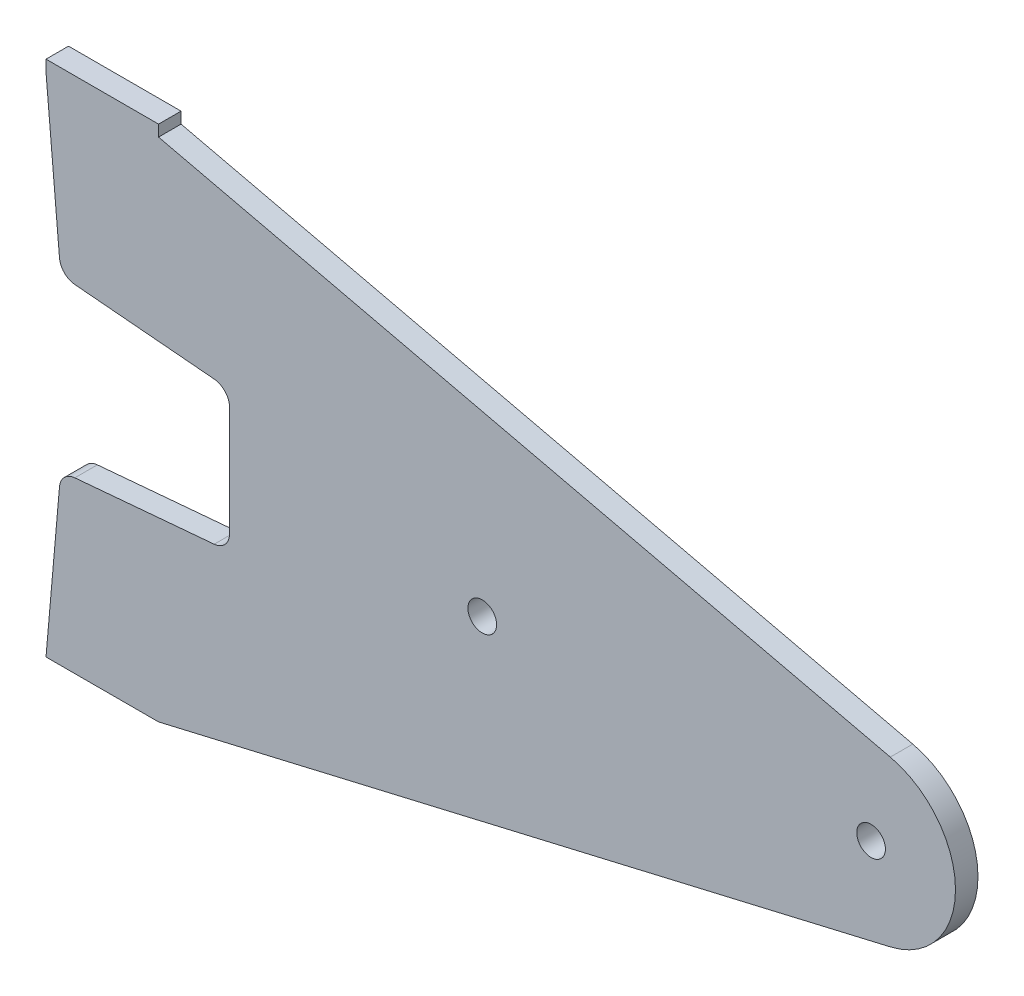
ISO-10303-21;
HEADER;
FILE_DESCRIPTION(('STEP AP214'),'2;1');
FILE_NAME('part.step','',(''),(''),'','','');
FILE_SCHEMA(('AUTOMOTIVE_DESIGN { 1 0 10303 214 1 1 1 1 }'));
ENDSEC;
DATA;
#1=APPLICATION_CONTEXT('core data for automotive mechanical design processes');
#2=APPLICATION_PROTOCOL_DEFINITION('international standard','automotive_design',2000,#1);
#3=PRODUCT_CONTEXT('',#1,'mechanical');
#4=PRODUCT('Part','Part','',(#3));
#5=PRODUCT_RELATED_PRODUCT_CATEGORY('part','',(#4));
#6=PRODUCT_DEFINITION_FORMATION('','',#4);
#7=PRODUCT_DEFINITION_CONTEXT('part definition',#1,'design');
#8=PRODUCT_DEFINITION('design','',#6,#7);
#9=PRODUCT_DEFINITION_SHAPE('','',#8);
#10=(LENGTH_UNIT() NAMED_UNIT(*) SI_UNIT(.MILLI.,.METRE.));
#11=(NAMED_UNIT(*) PLANE_ANGLE_UNIT() SI_UNIT($,.RADIAN.));
#12=(NAMED_UNIT(*) SI_UNIT($,.STERADIAN.) SOLID_ANGLE_UNIT());
#13=UNCERTAINTY_MEASURE_WITH_UNIT(LENGTH_MEASURE(1.E-05),#10,'distance_accuracy_value','');
#14=(GEOMETRIC_REPRESENTATION_CONTEXT(3) GLOBAL_UNCERTAINTY_ASSIGNED_CONTEXT((#13)) GLOBAL_UNIT_ASSIGNED_CONTEXT((#10,
#11,#12)) REPRESENTATION_CONTEXT('',''));
#15=CARTESIAN_POINT('',(0.,0.,0.));
#16=DIRECTION('',(0.,0.,1.));
#17=DIRECTION('',(1.,0.,0.));
#18=AXIS2_PLACEMENT_3D('',#15,#16,#17);
#19=CARTESIAN_POINT('',(159.09516778292,0.,4.));
#20=DIRECTION('',(0.,0.,-1.));
#21=DIRECTION('',(-1.,0.,0.));
#22=AXIS2_PLACEMENT_3D('',#19,#20,#21);
#23=PLANE('',#22);
#24=CARTESIAN_POINT('',(159.09516778292,0.,4.));
#25=DIRECTION('',(0.,0.,1.));
#26=DIRECTION('',(1.,0.,0.));
#27=AXIS2_PLACEMENT_3D('',#24,#25,#26);
#28=CIRCLE('',#27,2.54999999999999);
#29=CARTESIAN_POINT('',(161.64516778292,0.,4.));
#30=VERTEX_POINT('',#29);
#31=EDGE_CURVE('E182',#30,#30,#28,.T.);
#32=ORIENTED_EDGE('',*,*,#31,.F.);
#33=EDGE_LOOP('',(#32));
#34=FACE_BOUND('',#33,.T.);
#35=DIRECTION('',(0.,-1.,0.));
#36=VECTOR('',#35,1.);
#37=CARTESIAN_POINT('',(12.4746193717496,45.0087166950281,4.));
#38=LINE('',#37,#36);
#39=CARTESIAN_POINT('',(12.4746193717496,47.,4.));
#40=VERTEX_POINT('',#39);
#41=CARTESIAN_POINT('',(12.4746193717496,45.0087166950281,4.));
#42=VERTEX_POINT('',#41);
#43=EDGE_CURVE('E210',#40,#42,#38,.T.);
#44=ORIENTED_EDGE('',*,*,#43,.T.);
#45=DIRECTION('',(0.0871669502809188,-0.996193717496112,0.));
#46=VECTOR('',#45,1.);
#47=CARTESIAN_POINT('',(12.7062507581159,42.3615008508427,4.));
#48=LINE('',#47,#46);
#49=CARTESIAN_POINT('',(14.8728851091224,17.599965410768,4.));
#50=VERTEX_POINT('',#49);
#51=EDGE_CURVE('E117',#42,#50,#48,.T.);
#52=ORIENTED_EDGE('',*,*,#51,.T.);
#53=CARTESIAN_POINT('',(17.8614662616107,17.8614662616107,4.));
#54=DIRECTION('',(0.,0.,1.));
#55=DIRECTION('',(1.,0.,0.));
#56=AXIS2_PLACEMENT_3D('',#53,#54,#55);
#57=CIRCLE('',#56,3.);
#58=CARTESIAN_POINT('',(17.599965410768,14.8728851091224,4.));
#59=VERTEX_POINT('',#58);
#60=EDGE_CURVE('E249',#50,#59,#57,.T.);
#61=ORIENTED_EDGE('',*,*,#60,.T.);
#62=DIRECTION('',(0.996193717496113,-0.0871669502809097,0.));
#63=VECTOR('',#62,1.);
#64=CARTESIAN_POINT('',(17.599965410768,14.8728851091224,4.));
#65=LINE('',#64,#63);
#66=CARTESIAN_POINT('',(42.3615008508427,12.7062507581158,4.));
#67=VERTEX_POINT('',#66);
#68=EDGE_CURVE('E268',#59,#67,#65,.T.);
#69=ORIENTED_EDGE('',*,*,#68,.T.);
#70=CARTESIAN_POINT('',(42.1,9.71766960562749,4.));
#71=DIRECTION('',(0.,0.,-1.));
#72=DIRECTION('',(-1.,0.,0.));
#73=AXIS2_PLACEMENT_3D('',#70,#71,#72);
#74=CIRCLE('',#73,3.);
#75=CARTESIAN_POINT('',(45.1,9.71766960562747,4.));
#76=VERTEX_POINT('',#75);
#77=EDGE_CURVE('E265',#67,#76,#74,.T.);
#78=ORIENTED_EDGE('',*,*,#77,.T.);
#79=DIRECTION('',(0.,-1.,0.));
#80=VECTOR('',#79,1.);
#81=CARTESIAN_POINT('',(45.1,-9.71766960562747,4.));
#82=LINE('',#81,#80);
#83=CARTESIAN_POINT('',(45.1,-9.71766960562747,4.));
#84=VERTEX_POINT('',#83);
#85=EDGE_CURVE('E267',#76,#84,#82,.T.);
#86=ORIENTED_EDGE('',*,*,#85,.T.);
#87=CARTESIAN_POINT('',(42.1,-9.71766960562749,4.));
#88=DIRECTION('',(0.,0.,-1.));
#89=DIRECTION('',(1.,0.,0.));
#90=AXIS2_PLACEMENT_3D('',#87,#88,#89);
#91=CIRCLE('',#90,3.);
#92=CARTESIAN_POINT('',(42.3615008508427,-12.7062507581158,4.));
#93=VERTEX_POINT('',#92);
#94=EDGE_CURVE('E270',#84,#93,#91,.T.);
#95=ORIENTED_EDGE('',*,*,#94,.T.);
#96=DIRECTION('',(-0.996193717496113,-0.0871669502809097,0.));
#97=VECTOR('',#96,1.);
#98=CARTESIAN_POINT('',(17.599965410768,-14.8728851091224,4.));
#99=LINE('',#98,#97);
#100=CARTESIAN_POINT('',(17.599965410768,-14.8728851091224,4.));
#101=VERTEX_POINT('',#100);
#102=EDGE_CURVE('E276',#93,#101,#99,.T.);
#103=ORIENTED_EDGE('',*,*,#102,.T.);
#104=CARTESIAN_POINT('',(17.8614662616107,-17.8614662616107,4.));
#105=DIRECTION('',(0.,0.,1.));
#106=DIRECTION('',(-1.,0.,0.));
#107=AXIS2_PLACEMENT_3D('',#104,#105,#106);
#108=CIRCLE('',#107,3.);
#109=CARTESIAN_POINT('',(14.8728851091224,-17.599965410768,4.));
#110=VERTEX_POINT('',#109);
#111=EDGE_CURVE('E278',#101,#110,#108,.T.);
#112=ORIENTED_EDGE('',*,*,#111,.T.);
#113=DIRECTION('',(-0.0871669502809082,-0.996193717496113,0.));
#114=VECTOR('',#113,1.);
#115=CARTESIAN_POINT('',(14.8728851091224,-17.599965410768,4.));
#116=LINE('',#115,#114);
#117=CARTESIAN_POINT('',(12.4746193717496,-45.0087166950281,4.));
#118=VERTEX_POINT('',#117);
#119=EDGE_CURVE('E280',#110,#118,#116,.T.);
#120=ORIENTED_EDGE('',*,*,#119,.T.);
#121=DIRECTION('',(0.999999905024048,0.000435834710011349,0.));
#122=VECTOR('',#121,1.);
#123=CARTESIAN_POINT('',(32.4746193717497,-45.,4.));
#124=LINE('',#123,#122);
#125=CARTESIAN_POINT('',(32.4746193717497,-45.,4.));
#126=VERTEX_POINT('',#125);
#127=EDGE_CURVE('E282',#118,#126,#124,.T.);
#128=ORIENTED_EDGE('',*,*,#127,.T.);
#129=DIRECTION('',(0.973754498982734,0.227600913247036,0.));
#130=VECTOR('',#129,1.);
#131=CARTESIAN_POINT('',(32.4746193717497,-45.,4.));
#132=LINE('',#131,#130);
#133=CARTESIAN_POINT('',(162.509181481625,-14.6063174847412,4.));
#134=VERTEX_POINT('',#133);
#135=EDGE_CURVE('E284',#126,#134,#132,.T.);
#136=ORIENTED_EDGE('',*,*,#135,.T.);
#137=CARTESIAN_POINT('',(159.09516778292,0.,4.));
#138=DIRECTION('',(0.,0.,1.));
#139=DIRECTION('',(-1.,0.,0.));
#140=AXIS2_PLACEMENT_3D('',#137,#138,#139);
#141=CIRCLE('',#140,15.);
#142=CARTESIAN_POINT('',(162.509181481625,14.6063174847412,4.));
#143=VERTEX_POINT('',#142);
#144=EDGE_CURVE('E160',#134,#143,#141,.T.);
#145=ORIENTED_EDGE('',*,*,#144,.T.);
#146=DIRECTION('',(-0.973754498982734,0.227600913247036,0.));
#147=VECTOR('',#146,1.);
#148=CARTESIAN_POINT('',(32.4746193717497,45.,4.));
#149=LINE('',#148,#147);
#150=CARTESIAN_POINT('',(32.4746193717497,45.,4.));
#151=VERTEX_POINT('',#150);
#152=EDGE_CURVE('E154',#143,#151,#149,.T.);
#153=ORIENTED_EDGE('',*,*,#152,.T.);
#154=DIRECTION('',(0.,1.,0.));
#155=VECTOR('',#154,1.);
#156=CARTESIAN_POINT('',(32.4746193717497,47.,4.));
#157=LINE('',#156,#155);
#158=CARTESIAN_POINT('',(32.4746193717497,47.,4.));
#159=VERTEX_POINT('',#158);
#160=EDGE_CURVE('E158',#151,#159,#157,.T.);
#161=ORIENTED_EDGE('',*,*,#160,.T.);
#162=DIRECTION('',(-1.,0.,0.));
#163=VECTOR('',#162,1.);
#164=CARTESIAN_POINT('',(12.4746193717496,47.,4.));
#165=LINE('',#164,#163);
#166=EDGE_CURVE('E50',#159,#40,#165,.T.);
#167=ORIENTED_EDGE('',*,*,#166,.T.);
#168=EDGE_LOOP('',(#44,#52,#61,#69,#78,#86,#95,#103,#112,#120,#128,#136,#145,#153,#161,#167));
#169=FACE_BOUND('',#168,.T.);
#170=CARTESIAN_POINT('',(90.,0.,4.));
#171=DIRECTION('',(0.,0.,1.));
#172=DIRECTION('',(1.,0.,0.));
#173=AXIS2_PLACEMENT_3D('',#170,#171,#172);
#174=CIRCLE('',#173,2.54999999999999);
#175=CARTESIAN_POINT('',(92.55,0.,4.));
#176=VERTEX_POINT('',#175);
#177=EDGE_CURVE('E327',#176,#176,#174,.T.);
#178=ORIENTED_EDGE('',*,*,#177,.F.);
#179=EDGE_LOOP('',(#178));
#180=FACE_BOUND('',#179,.T.);
#181=ADVANCED_FACE('F33',(#34,#169,#180),#23,.F.);
#182=CARTESIAN_POINT('',(159.09516778292,0.,0.));
#183=DIRECTION('',(0.,0.,-1.));
#184=DIRECTION('',(-1.,0.,0.));
#185=AXIS2_PLACEMENT_3D('',#182,#183,#184);
#186=PLANE('',#185);
#187=CARTESIAN_POINT('',(159.09516778292,0.,0.));
#188=DIRECTION('',(0.,0.,1.));
#189=DIRECTION('',(1.,0.,0.));
#190=AXIS2_PLACEMENT_3D('',#187,#188,#189);
#191=CIRCLE('',#190,2.54999999999999);
#192=CARTESIAN_POINT('',(161.64516778292,0.,0.));
#193=VERTEX_POINT('',#192);
#194=EDGE_CURVE('E332',#193,#193,#191,.T.);
#195=ORIENTED_EDGE('',*,*,#194,.T.);
#196=EDGE_LOOP('',(#195));
#197=FACE_BOUND('',#196,.T.);
#198=DIRECTION('',(0.,-1.,0.));
#199=VECTOR('',#198,1.);
#200=CARTESIAN_POINT('',(12.4746193717496,45.0087166950281,0.));
#201=LINE('',#200,#199);
#202=CARTESIAN_POINT('',(12.4746193717496,47.,0.));
#203=VERTEX_POINT('',#202);
#204=CARTESIAN_POINT('',(12.4746193717496,45.0087166950281,0.));
#205=VERTEX_POINT('',#204);
#206=EDGE_CURVE('E178',#203,#205,#201,.T.);
#207=ORIENTED_EDGE('',*,*,#206,.F.);
#208=DIRECTION('',(-1.,0.,0.));
#209=VECTOR('',#208,1.);
#210=CARTESIAN_POINT('',(12.4746193717496,47.,0.));
#211=LINE('',#210,#209);
#212=CARTESIAN_POINT('',(32.4746193717497,47.,0.));
#213=VERTEX_POINT('',#212);
#214=EDGE_CURVE('E109',#213,#203,#211,.T.);
#215=ORIENTED_EDGE('',*,*,#214,.F.);
#216=DIRECTION('',(0.,1.,0.));
#217=VECTOR('',#216,1.);
#218=CARTESIAN_POINT('',(32.4746193717497,47.,0.));
#219=LINE('',#218,#217);
#220=CARTESIAN_POINT('',(32.4746193717497,45.,0.));
#221=VERTEX_POINT('',#220);
#222=EDGE_CURVE('E103',#221,#213,#219,.T.);
#223=ORIENTED_EDGE('',*,*,#222,.F.);
#224=DIRECTION('',(-0.973754498982734,0.227600913247036,0.));
#225=VECTOR('',#224,1.);
#226=CARTESIAN_POINT('',(32.4746193717497,45.,0.));
#227=LINE('',#226,#225);
#228=CARTESIAN_POINT('',(162.509181481625,14.6063174847412,0.));
#229=VERTEX_POINT('',#228);
#230=EDGE_CURVE('E168',#229,#221,#227,.T.);
#231=ORIENTED_EDGE('',*,*,#230,.F.);
#232=CARTESIAN_POINT('',(159.09516778292,0.,0.));
#233=DIRECTION('',(0.,0.,1.));
#234=DIRECTION('',(-1.,0.,0.));
#235=AXIS2_PLACEMENT_3D('',#232,#233,#234);
#236=CIRCLE('',#235,15.);
#237=CARTESIAN_POINT('',(162.509181481625,-14.6063174847412,0.));
#238=VERTEX_POINT('',#237);
#239=EDGE_CURVE('E205',#238,#229,#236,.T.);
#240=ORIENTED_EDGE('',*,*,#239,.F.);
#241=DIRECTION('',(0.973754498982734,0.227600913247036,0.));
#242=VECTOR('',#241,1.);
#243=CARTESIAN_POINT('',(32.4746193717497,-45.,0.));
#244=LINE('',#243,#242);
#245=CARTESIAN_POINT('',(32.4746193717497,-45.,0.));
#246=VERTEX_POINT('',#245);
#247=EDGE_CURVE('E203',#246,#238,#244,.T.);
#248=ORIENTED_EDGE('',*,*,#247,.F.);
#249=DIRECTION('',(0.999999905024048,0.000435834710011349,0.));
#250=VECTOR('',#249,1.);
#251=CARTESIAN_POINT('',(32.4746193717497,-45.,0.));
#252=LINE('',#251,#250);
#253=CARTESIAN_POINT('',(12.4746193717496,-45.0087166950281,0.));
#254=VERTEX_POINT('',#253);
#255=EDGE_CURVE('E201',#254,#246,#252,.T.);
#256=ORIENTED_EDGE('',*,*,#255,.F.);
#257=DIRECTION('',(-0.0871669502809188,-0.996193717496112,0.));
#258=VECTOR('',#257,1.);
#259=CARTESIAN_POINT('',(12.7062507581159,-42.3615008508427,0.));
#260=LINE('',#259,#258);
#261=CARTESIAN_POINT('',(14.8728851091224,-17.599965410768,0.));
#262=VERTEX_POINT('',#261);
#263=EDGE_CURVE('E199',#262,#254,#260,.T.);
#264=ORIENTED_EDGE('',*,*,#263,.F.);
#265=CARTESIAN_POINT('',(17.8614662616107,-17.8614662616107,0.));
#266=DIRECTION('',(0.,0.,1.));
#267=DIRECTION('',(-1.,0.,0.));
#268=AXIS2_PLACEMENT_3D('',#265,#266,#267);
#269=CIRCLE('',#268,3.);
#270=CARTESIAN_POINT('',(17.599965410768,-14.8728851091224,0.));
#271=VERTEX_POINT('',#270);
#272=EDGE_CURVE('E196',#271,#262,#269,.T.);
#273=ORIENTED_EDGE('',*,*,#272,.F.);
#274=DIRECTION('',(-0.996193717496113,-0.0871669502809097,0.));
#275=VECTOR('',#274,1.);
#276=CARTESIAN_POINT('',(17.599965410768,-14.8728851091224,0.));
#277=LINE('',#276,#275);
#278=CARTESIAN_POINT('',(42.3615008508427,-12.7062507581158,0.));
#279=VERTEX_POINT('',#278);
#280=EDGE_CURVE('E194',#279,#271,#277,.T.);
#281=ORIENTED_EDGE('',*,*,#280,.F.);
#282=CARTESIAN_POINT('',(42.1,-9.71766960562749,0.));
#283=DIRECTION('',(0.,0.,-1.));
#284=DIRECTION('',(1.,0.,0.));
#285=AXIS2_PLACEMENT_3D('',#282,#283,#284);
#286=CIRCLE('',#285,3.);
#287=CARTESIAN_POINT('',(45.1,-9.71766960562747,0.));
#288=VERTEX_POINT('',#287);
#289=EDGE_CURVE('E192',#288,#279,#286,.T.);
#290=ORIENTED_EDGE('',*,*,#289,.F.);
#291=DIRECTION('',(0.,-1.,0.));
#292=VECTOR('',#291,1.);
#293=CARTESIAN_POINT('',(45.1,-9.71766960562747,0.));
#294=LINE('',#293,#292);
#295=CARTESIAN_POINT('',(45.1,9.71766960562747,0.));
#296=VERTEX_POINT('',#295);
#297=EDGE_CURVE('E190',#296,#288,#294,.T.);
#298=ORIENTED_EDGE('',*,*,#297,.F.);
#299=CARTESIAN_POINT('',(42.1,9.71766960562749,0.));
#300=DIRECTION('',(0.,0.,-1.));
#301=DIRECTION('',(-1.,0.,0.));
#302=AXIS2_PLACEMENT_3D('',#299,#300,#301);
#303=CIRCLE('',#302,3.);
#304=CARTESIAN_POINT('',(42.3615008508427,12.7062507581158,0.));
#305=VERTEX_POINT('',#304);
#306=EDGE_CURVE('E188',#305,#296,#303,.T.);
#307=ORIENTED_EDGE('',*,*,#306,.F.);
#308=DIRECTION('',(0.996193717496113,-0.0871669502809097,0.));
#309=VECTOR('',#308,1.);
#310=CARTESIAN_POINT('',(17.599965410768,14.8728851091224,0.));
#311=LINE('',#310,#309);
#312=CARTESIAN_POINT('',(17.599965410768,14.8728851091224,0.));
#313=VERTEX_POINT('',#312);
#314=EDGE_CURVE('E186',#313,#305,#311,.T.);
#315=ORIENTED_EDGE('',*,*,#314,.F.);
#316=CARTESIAN_POINT('',(17.8614662616107,17.8614662616107,0.));
#317=DIRECTION('',(0.,0.,1.));
#318=DIRECTION('',(1.,0.,0.));
#319=AXIS2_PLACEMENT_3D('',#316,#317,#318);
#320=CIRCLE('',#319,3.);
#321=CARTESIAN_POINT('',(14.8728851091224,17.599965410768,0.));
#322=VERTEX_POINT('',#321);
#323=EDGE_CURVE('E184',#322,#313,#320,.T.);
#324=ORIENTED_EDGE('',*,*,#323,.F.);
#325=DIRECTION('',(0.0871669502809082,-0.996193717496113,0.));
#326=VECTOR('',#325,1.);
#327=CARTESIAN_POINT('',(14.8728851091224,17.599965410768,0.));
#328=LINE('',#327,#326);
#329=EDGE_CURVE('E181',#205,#322,#328,.T.);
#330=ORIENTED_EDGE('',*,*,#329,.F.);
#331=EDGE_LOOP('',(#207,#215,#223,#231,#240,#248,#256,#264,#273,#281,#290,#298,#307,#315,#324,#330));
#332=FACE_BOUND('',#331,.T.);
#333=CARTESIAN_POINT('',(90.,0.,0.));
#334=DIRECTION('',(0.,0.,1.));
#335=DIRECTION('',(1.,0.,0.));
#336=AXIS2_PLACEMENT_3D('',#333,#334,#335);
#337=CIRCLE('',#336,2.54999999999999);
#338=CARTESIAN_POINT('',(92.55,0.,0.));
#339=VERTEX_POINT('',#338);
#340=EDGE_CURVE('E330',#339,#339,#337,.T.);
#341=ORIENTED_EDGE('',*,*,#340,.T.);
#342=EDGE_LOOP('',(#341));
#343=FACE_BOUND('',#342,.T.);
#344=ADVANCED_FACE('F253',(#197,#332,#343),#186,.T.);
#345=CARTESIAN_POINT('',(12.4746193717496,45.0087166950281,4.));
#346=DIRECTION('',(1.,0.,0.));
#347=DIRECTION('',(0.,1.,0.));
#348=AXIS2_PLACEMENT_3D('',#345,#346,#347);
#349=PLANE('',#348);
#350=ORIENTED_EDGE('',*,*,#206,.T.);
#351=DIRECTION('',(0.,0.,-1.));
#352=VECTOR('',#351,1.);
#353=CARTESIAN_POINT('',(12.4746193717496,45.0087166950281,4.));
#354=LINE('',#353,#352);
#355=EDGE_CURVE('E11',#42,#205,#354,.T.);
#356=ORIENTED_EDGE('',*,*,#355,.F.);
#357=ORIENTED_EDGE('',*,*,#43,.F.);
#358=DIRECTION('',(0.,0.,-1.));
#359=VECTOR('',#358,1.);
#360=CARTESIAN_POINT('',(12.4746193717496,47.,4.));
#361=LINE('',#360,#359);
#362=EDGE_CURVE('E174',#40,#203,#361,.T.);
#363=ORIENTED_EDGE('',*,*,#362,.T.);
#364=EDGE_LOOP('',(#350,#356,#357,#363));
#365=FACE_BOUND('',#364,.T.);
#366=ADVANCED_FACE('F35',(#365),#349,.F.);
#367=CARTESIAN_POINT('',(14.8728851091224,17.599965410768,4.));
#368=DIRECTION('',(0.996193717496113,0.0871669502809082,0.));
#369=DIRECTION('',(-0.0871669502809082,0.996193717496113,0.));
#370=AXIS2_PLACEMENT_3D('',#367,#368,#369);
#371=PLANE('',#370);
#372=ORIENTED_EDGE('',*,*,#329,.T.);
#373=DIRECTION('',(0.,0.,-1.));
#374=VECTOR('',#373,1.);
#375=CARTESIAN_POINT('',(14.8728851091224,17.599965410768,4.));
#376=LINE('',#375,#374);
#377=EDGE_CURVE('E42',#50,#322,#376,.T.);
#378=ORIENTED_EDGE('',*,*,#377,.F.);
#379=ORIENTED_EDGE('',*,*,#51,.F.);
#380=ORIENTED_EDGE('',*,*,#355,.T.);
#381=EDGE_LOOP('',(#372,#378,#379,#380));
#382=FACE_BOUND('',#381,.T.);
#383=ADVANCED_FACE('F466',(#382),#371,.F.);
#384=CARTESIAN_POINT('',(17.8614662616107,17.8614662616107,4.));
#385=DIRECTION('',(0.,0.,-1.));
#386=DIRECTION('',(-1.,0.,0.));
#387=AXIS2_PLACEMENT_3D('',#384,#385,#386);
#388=CYLINDRICAL_SURFACE('',#387,3.);
#389=ORIENTED_EDGE('',*,*,#323,.T.);
#390=DIRECTION('',(0.,0.,-1.));
#391=VECTOR('',#390,1.);
#392=CARTESIAN_POINT('',(17.599965410768,14.8728851091224,4.));
#393=LINE('',#392,#391);
#394=EDGE_CURVE('E241',#59,#313,#393,.T.);
#395=ORIENTED_EDGE('',*,*,#394,.F.);
#396=ORIENTED_EDGE('',*,*,#60,.F.);
#397=ORIENTED_EDGE('',*,*,#377,.T.);
#398=EDGE_LOOP('',(#389,#395,#396,#397));
#399=FACE_BOUND('',#398,.T.);
#400=ADVANCED_FACE('F247',(#399),#388,.T.);
#401=CARTESIAN_POINT('',(17.599965410768,14.8728851091224,4.));
#402=DIRECTION('',(0.0871669502809097,0.996193717496113,0.));
#403=DIRECTION('',(-0.996193717496113,0.0871669502809097,0.));
#404=AXIS2_PLACEMENT_3D('',#401,#402,#403);
#405=PLANE('',#404);
#406=ORIENTED_EDGE('',*,*,#314,.T.);
#407=DIRECTION('',(0.,0.,-1.));
#408=VECTOR('',#407,1.);
#409=CARTESIAN_POINT('',(42.3615008508427,12.7062507581158,4.));
#410=LINE('',#409,#408);
#411=EDGE_CURVE('E238',#67,#305,#410,.T.);
#412=ORIENTED_EDGE('',*,*,#411,.F.);
#413=ORIENTED_EDGE('',*,*,#68,.F.);
#414=ORIENTED_EDGE('',*,*,#394,.T.);
#415=EDGE_LOOP('',(#406,#412,#413,#414));
#416=FACE_BOUND('',#415,.T.);
#417=ADVANCED_FACE('F259',(#416),#405,.F.);
#418=CARTESIAN_POINT('',(42.1,9.71766960562749,4.));
#419=DIRECTION('',(0.,0.,-1.));
#420=DIRECTION('',(-1.,0.,0.));
#421=AXIS2_PLACEMENT_3D('',#418,#419,#420);
#422=CYLINDRICAL_SURFACE('',#421,3.);
#423=ORIENTED_EDGE('',*,*,#306,.T.);
#424=DIRECTION('',(0.,0.,-1.));
#425=VECTOR('',#424,1.);
#426=CARTESIAN_POINT('',(45.1,9.71766960562747,4.));
#427=LINE('',#426,#425);
#428=EDGE_CURVE('E235',#76,#296,#427,.T.);
#429=ORIENTED_EDGE('',*,*,#428,.F.);
#430=ORIENTED_EDGE('',*,*,#77,.F.);
#431=ORIENTED_EDGE('',*,*,#411,.T.);
#432=EDGE_LOOP('',(#423,#429,#430,#431));
#433=FACE_BOUND('',#432,.T.);
#434=ADVANCED_FACE('F263',(#433),#422,.F.);
#435=CARTESIAN_POINT('',(45.1,-9.71766960562747,4.));
#436=DIRECTION('',(1.,0.,0.));
#437=DIRECTION('',(0.,0.,-1.));
#438=AXIS2_PLACEMENT_3D('',#435,#436,#437);
#439=PLANE('',#438);
#440=ORIENTED_EDGE('',*,*,#297,.T.);
#441=DIRECTION('',(0.,0.,-1.));
#442=VECTOR('',#441,1.);
#443=CARTESIAN_POINT('',(45.1,-9.71766960562747,4.));
#444=LINE('',#443,#442);
#445=EDGE_CURVE('E232',#84,#288,#444,.T.);
#446=ORIENTED_EDGE('',*,*,#445,.F.);
#447=ORIENTED_EDGE('',*,*,#85,.F.);
#448=ORIENTED_EDGE('',*,*,#428,.T.);
#449=EDGE_LOOP('',(#440,#446,#447,#448));
#450=FACE_BOUND('',#449,.T.);
#451=ADVANCED_FACE('F431',(#450),#439,.F.);
#452=CARTESIAN_POINT('',(42.1,-9.71766960562749,4.));
#453=DIRECTION('',(0.,0.,-1.));
#454=DIRECTION('',(-1.,0.,0.));
#455=AXIS2_PLACEMENT_3D('',#452,#453,#454);
#456=CYLINDRICAL_SURFACE('',#455,3.);
#457=ORIENTED_EDGE('',*,*,#289,.T.);
#458=DIRECTION('',(0.,0.,-1.));
#459=VECTOR('',#458,1.);
#460=CARTESIAN_POINT('',(42.3615008508427,-12.7062507581158,4.));
#461=LINE('',#460,#459);
#462=EDGE_CURVE('E229',#93,#279,#461,.T.);
#463=ORIENTED_EDGE('',*,*,#462,.F.);
#464=ORIENTED_EDGE('',*,*,#94,.F.);
#465=ORIENTED_EDGE('',*,*,#445,.T.);
#466=EDGE_LOOP('',(#457,#463,#464,#465));
#467=FACE_BOUND('',#466,.T.);
#468=ADVANCED_FACE('F421',(#467),#456,.F.);
#469=CARTESIAN_POINT('',(17.599965410768,-14.8728851091224,4.));
#470=DIRECTION('',(0.0871669502809097,-0.996193717496113,0.));
#471=DIRECTION('',(0.996193717496113,0.0871669502809097,0.));
#472=AXIS2_PLACEMENT_3D('',#469,#470,#471);
#473=PLANE('',#472);
#474=ORIENTED_EDGE('',*,*,#280,.T.);
#475=DIRECTION('',(0.,0.,-1.));
#476=VECTOR('',#475,1.);
#477=CARTESIAN_POINT('',(17.599965410768,-14.8728851091224,4.));
#478=LINE('',#477,#476);
#479=EDGE_CURVE('E226',#101,#271,#478,.T.);
#480=ORIENTED_EDGE('',*,*,#479,.F.);
#481=ORIENTED_EDGE('',*,*,#102,.F.);
#482=ORIENTED_EDGE('',*,*,#462,.T.);
#483=EDGE_LOOP('',(#474,#480,#481,#482));
#484=FACE_BOUND('',#483,.T.);
#485=ADVANCED_FACE('F411',(#484),#473,.F.);
#486=CARTESIAN_POINT('',(17.8614662616107,-17.8614662616107,4.));
#487=DIRECTION('',(0.,0.,-1.));
#488=DIRECTION('',(-1.,0.,0.));
#489=AXIS2_PLACEMENT_3D('',#486,#487,#488);
#490=CYLINDRICAL_SURFACE('',#489,3.);
#491=ORIENTED_EDGE('',*,*,#272,.T.);
#492=DIRECTION('',(0.,0.,-1.));
#493=VECTOR('',#492,1.);
#494=CARTESIAN_POINT('',(14.8728851091224,-17.599965410768,4.));
#495=LINE('',#494,#493);
#496=EDGE_CURVE('E223',#110,#262,#495,.T.);
#497=ORIENTED_EDGE('',*,*,#496,.F.);
#498=ORIENTED_EDGE('',*,*,#111,.F.);
#499=ORIENTED_EDGE('',*,*,#479,.T.);
#500=EDGE_LOOP('',(#491,#497,#498,#499));
#501=FACE_BOUND('',#500,.T.);
#502=ADVANCED_FACE('F400',(#501),#490,.T.);
#503=CARTESIAN_POINT('',(12.7062507581159,-42.3615008508427,4.));
#504=DIRECTION('',(0.996193717496112,-0.0871669502809188,0.));
#505=DIRECTION('',(0.0871669502809188,0.996193717496112,0.));
#506=AXIS2_PLACEMENT_3D('',#503,#504,#505);
#507=PLANE('',#506);
#508=ORIENTED_EDGE('',*,*,#263,.T.);
#509=DIRECTION('',(0.,0.,-1.));
#510=VECTOR('',#509,1.);
#511=CARTESIAN_POINT('',(12.4746193717496,-45.0087166950281,4.));
#512=LINE('',#511,#510);
#513=EDGE_CURVE('E220',#118,#254,#512,.T.);
#514=ORIENTED_EDGE('',*,*,#513,.F.);
#515=ORIENTED_EDGE('',*,*,#119,.F.);
#516=ORIENTED_EDGE('',*,*,#496,.T.);
#517=EDGE_LOOP('',(#508,#514,#515,#516));
#518=FACE_BOUND('',#517,.T.);
#519=ADVANCED_FACE('F390',(#518),#507,.F.);
#520=CARTESIAN_POINT('',(32.4746193717497,-45.,4.));
#521=DIRECTION('',(-0.000435834710011349,0.999999905024048,0.));
#522=DIRECTION('',(-0.999999905024048,-0.000435834710011349,0.));
#523=AXIS2_PLACEMENT_3D('',#520,#521,#522);
#524=PLANE('',#523);
#525=ORIENTED_EDGE('',*,*,#255,.T.);
#526=DIRECTION('',(0.,0.,-1.));
#527=VECTOR('',#526,1.);
#528=CARTESIAN_POINT('',(32.4746193717497,-45.,4.));
#529=LINE('',#528,#527);
#530=EDGE_CURVE('E217',#126,#246,#529,.T.);
#531=ORIENTED_EDGE('',*,*,#530,.F.);
#532=ORIENTED_EDGE('',*,*,#127,.F.);
#533=ORIENTED_EDGE('',*,*,#513,.T.);
#534=EDGE_LOOP('',(#525,#531,#532,#533));
#535=FACE_BOUND('',#534,.T.);
#536=ADVANCED_FACE('F381',(#535),#524,.F.);
#537=CARTESIAN_POINT('',(32.4746193717497,-45.,4.));
#538=DIRECTION('',(-0.227600913247036,0.973754498982734,0.));
#539=DIRECTION('',(-0.973754498982734,-0.227600913247036,0.));
#540=AXIS2_PLACEMENT_3D('',#537,#538,#539);
#541=PLANE('',#540);
#542=ORIENTED_EDGE('',*,*,#247,.T.);
#543=DIRECTION('',(0.,0.,-1.));
#544=VECTOR('',#543,1.);
#545=CARTESIAN_POINT('',(162.509181481625,-14.6063174847412,4.));
#546=LINE('',#545,#544);
#547=EDGE_CURVE('E214',#134,#238,#546,.T.);
#548=ORIENTED_EDGE('',*,*,#547,.F.);
#549=ORIENTED_EDGE('',*,*,#135,.F.);
#550=ORIENTED_EDGE('',*,*,#530,.T.);
#551=EDGE_LOOP('',(#542,#548,#549,#550));
#552=FACE_BOUND('',#551,.T.);
#553=ADVANCED_FACE('F290',(#552),#541,.F.);
#554=CARTESIAN_POINT('',(159.09516778292,0.,4.));
#555=DIRECTION('',(0.,0.,-1.));
#556=DIRECTION('',(-1.,0.,0.));
#557=AXIS2_PLACEMENT_3D('',#554,#555,#556);
#558=CYLINDRICAL_SURFACE('',#557,15.);
#559=ORIENTED_EDGE('',*,*,#239,.T.);
#560=DIRECTION('',(0.,0.,-1.));
#561=VECTOR('',#560,1.);
#562=CARTESIAN_POINT('',(162.509181481625,14.6063174847412,4.));
#563=LINE('',#562,#561);
#564=EDGE_CURVE('E169',#143,#229,#563,.T.);
#565=ORIENTED_EDGE('',*,*,#564,.F.);
#566=ORIENTED_EDGE('',*,*,#144,.F.);
#567=ORIENTED_EDGE('',*,*,#547,.T.);
#568=EDGE_LOOP('',(#559,#565,#566,#567));
#569=FACE_BOUND('',#568,.T.);
#570=ADVANCED_FACE('F294',(#569),#558,.T.);
#571=CARTESIAN_POINT('',(32.4746193717497,45.,4.));
#572=DIRECTION('',(-0.227600913247036,-0.973754498982734,0.));
#573=DIRECTION('',(0.973754498982734,-0.227600913247036,0.));
#574=AXIS2_PLACEMENT_3D('',#571,#572,#573);
#575=PLANE('',#574);
#576=ORIENTED_EDGE('',*,*,#230,.T.);
#577=DIRECTION('',(0.,0.,-1.));
#578=VECTOR('',#577,1.);
#579=CARTESIAN_POINT('',(32.4746193717497,45.,4.));
#580=LINE('',#579,#578);
#581=EDGE_CURVE('E165',#151,#221,#580,.T.);
#582=ORIENTED_EDGE('',*,*,#581,.F.);
#583=ORIENTED_EDGE('',*,*,#152,.F.);
#584=ORIENTED_EDGE('',*,*,#564,.T.);
#585=EDGE_LOOP('',(#576,#582,#583,#584));
#586=FACE_BOUND('',#585,.T.);
#587=ADVANCED_FACE('F166',(#586),#575,.F.);
#588=CARTESIAN_POINT('',(32.4746193717497,47.,4.));
#589=DIRECTION('',(-1.,0.,0.));
#590=DIRECTION('',(0.,0.,1.));
#591=AXIS2_PLACEMENT_3D('',#588,#589,#590);
#592=PLANE('',#591);
#593=ORIENTED_EDGE('',*,*,#222,.T.);
#594=DIRECTION('',(0.,0.,-1.));
#595=VECTOR('',#594,1.);
#596=CARTESIAN_POINT('',(32.4746193717497,47.,4.));
#597=LINE('',#596,#595);
#598=EDGE_CURVE('E170',#159,#213,#597,.T.);
#599=ORIENTED_EDGE('',*,*,#598,.F.);
#600=ORIENTED_EDGE('',*,*,#160,.F.);
#601=ORIENTED_EDGE('',*,*,#581,.T.);
#602=EDGE_LOOP('',(#593,#599,#600,#601));
#603=FACE_BOUND('',#602,.T.);
#604=ADVANCED_FACE('F172',(#603),#592,.F.);
#605=CARTESIAN_POINT('',(12.4746193717496,47.,4.));
#606=DIRECTION('',(0.,-1.,0.));
#607=DIRECTION('',(1.,0.,0.));
#608=AXIS2_PLACEMENT_3D('',#605,#606,#607);
#609=PLANE('',#608);
#610=ORIENTED_EDGE('',*,*,#214,.T.);
#611=ORIENTED_EDGE('',*,*,#362,.F.);
#612=ORIENTED_EDGE('',*,*,#166,.F.);
#613=ORIENTED_EDGE('',*,*,#598,.T.);
#614=EDGE_LOOP('',(#610,#611,#612,#613));
#615=FACE_BOUND('',#614,.T.);
#616=ADVANCED_FACE('F298',(#615),#609,.F.);
#617=CARTESIAN_POINT('',(159.09516778292,0.,4.));
#618=DIRECTION('',(0.,0.,-1.));
#619=DIRECTION('',(-1.,0.,0.));
#620=AXIS2_PLACEMENT_3D('',#617,#618,#619);
#621=CYLINDRICAL_SURFACE('',#620,2.54999999999999);
#622=ORIENTED_EDGE('',*,*,#31,.T.);
#623=EDGE_LOOP('',(#622));
#624=FACE_BOUND('',#623,.T.);
#625=ORIENTED_EDGE('',*,*,#194,.F.);
#626=EDGE_LOOP('',(#625));
#627=FACE_BOUND('',#626,.T.);
#628=ADVANCED_FACE('F300',(#624,#627),#621,.F.);
#629=CARTESIAN_POINT('',(90.,0.,4.));
#630=DIRECTION('',(0.,0.,-1.));
#631=DIRECTION('',(-1.,0.,0.));
#632=AXIS2_PLACEMENT_3D('',#629,#630,#631);
#633=CYLINDRICAL_SURFACE('',#632,2.54999999999999);
#634=ORIENTED_EDGE('',*,*,#177,.T.);
#635=EDGE_LOOP('',(#634));
#636=FACE_BOUND('',#635,.T.);
#637=ORIENTED_EDGE('',*,*,#340,.F.);
#638=EDGE_LOOP('',(#637));
#639=FACE_BOUND('',#638,.T.);
#640=ADVANCED_FACE('F306',(#636,#639),#633,.F.);
#641=CLOSED_SHELL('',(#181,#344,#366,#383,#400,#417,#434,#451,#468,#485,#502,#519,#536,#553,
#570,#587,#604,#616,#628,#640));
#642=MANIFOLD_SOLID_BREP('B2',#641);
#643=ADVANCED_BREP_SHAPE_REPRESENTATION('',(#18,#642),#14);
#644=SHAPE_DEFINITION_REPRESENTATION(#9,#643);
ENDSEC;
END-ISO-10303-21;
